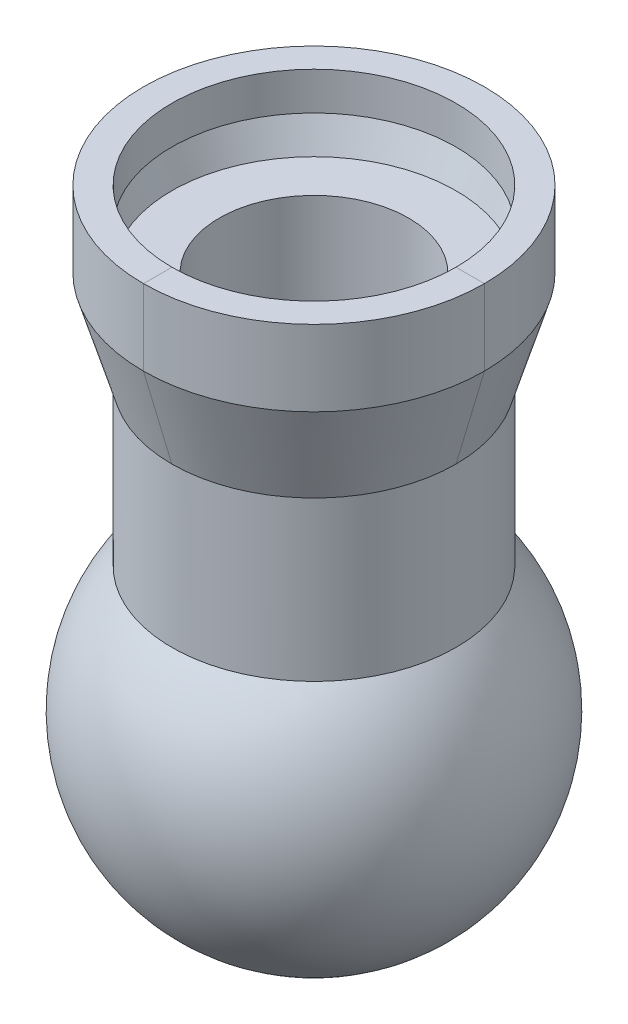
ISO-10303-21;
HEADER;
FILE_DESCRIPTION(('STEP AP214'),'2;1');
FILE_NAME('part.step','',(''),(''),'','','');
FILE_SCHEMA(('AUTOMOTIVE_DESIGN { 1 0 10303 214 1 1 1 1 }'));
ENDSEC;
DATA;
#1=APPLICATION_CONTEXT('core data for automotive mechanical design processes');
#2=APPLICATION_PROTOCOL_DEFINITION('international standard','automotive_design',2000,#1);
#3=PRODUCT_CONTEXT('',#1,'mechanical');
#4=PRODUCT('Part','Part','',(#3));
#5=PRODUCT_RELATED_PRODUCT_CATEGORY('part','',(#4));
#6=PRODUCT_DEFINITION_FORMATION('','',#4);
#7=PRODUCT_DEFINITION_CONTEXT('part definition',#1,'design');
#8=PRODUCT_DEFINITION('design','',#6,#7);
#9=PRODUCT_DEFINITION_SHAPE('','',#8);
#10=(LENGTH_UNIT() NAMED_UNIT(*) SI_UNIT(.MILLI.,.METRE.));
#11=(NAMED_UNIT(*) PLANE_ANGLE_UNIT() SI_UNIT($,.RADIAN.));
#12=(NAMED_UNIT(*) SI_UNIT($,.STERADIAN.) SOLID_ANGLE_UNIT());
#13=UNCERTAINTY_MEASURE_WITH_UNIT(LENGTH_MEASURE(1.E-05),#10,'distance_accuracy_value','');
#14=(GEOMETRIC_REPRESENTATION_CONTEXT(3) GLOBAL_UNCERTAINTY_ASSIGNED_CONTEXT((#13)) GLOBAL_UNIT_ASSIGNED_CONTEXT((#10,
#11,#12)) REPRESENTATION_CONTEXT('',''));
#15=CARTESIAN_POINT('',(0.,0.,0.));
#16=DIRECTION('',(0.,0.,1.));
#17=DIRECTION('',(1.,0.,0.));
#18=AXIS2_PLACEMENT_3D('',#15,#16,#17);
#19=CARTESIAN_POINT('',(0.,0.,0.));
#20=DIRECTION('',(0.,1.,0.));
#21=DIRECTION('',(-1.,0.,0.));
#22=AXIS2_PLACEMENT_3D('',#19,#20,#21);
#23=SPHERICAL_SURFACE('',#22,10.);
#24=CARTESIAN_POINT('',(0.,0.,0.));
#25=DIRECTION('',(0.,0.,1.));
#26=DIRECTION('',(1.,0.,0.));
#27=AXIS2_PLACEMENT_3D('',#24,#25,#26);
#28=CIRCLE('',#27,10.);
#29=CARTESIAN_POINT('',(5.,-8.66025403784439,0.));
#30=VERTEX_POINT('',#29);
#31=CARTESIAN_POINT('',(7.5,6.61437827766148,0.));
#32=VERTEX_POINT('',#31);
#33=EDGE_CURVE('E49',#30,#32,#28,.T.);
#34=ORIENTED_EDGE('',*,*,#33,.F.);
#35=CARTESIAN_POINT('',(0.,-8.66025403784439,0.));
#36=DIRECTION('',(0.,1.,0.));
#37=DIRECTION('',(0.,0.,1.));
#38=AXIS2_PLACEMENT_3D('',#35,#36,#37);
#39=CIRCLE('',#38,5.);
#40=EDGE_CURVE('E43',#30,#30,#39,.T.);
#41=ORIENTED_EDGE('',*,*,#40,.T.);
#42=ORIENTED_EDGE('',*,*,#33,.T.);
#43=CARTESIAN_POINT('',(0.,6.61437827766148,0.));
#44=DIRECTION('',(0.,-1.,0.));
#45=DIRECTION('',(0.,0.,-1.));
#46=AXIS2_PLACEMENT_3D('',#43,#44,#45);
#47=CIRCLE('',#46,7.5);
#48=EDGE_CURVE('E11',#32,#32,#47,.F.);
#49=ORIENTED_EDGE('',*,*,#48,.F.);
#50=EDGE_LOOP('',(#34,#41,#42,#49));
#51=FACE_BOUND('',#50,.T.);
#52=ADVANCED_FACE('F40',(#51),#23,.T.);
#53=CARTESIAN_POINT('',(0.,20.,0.));
#54=DIRECTION('',(0.,-1.,0.));
#55=DIRECTION('',(0.,0.,-1.));
#56=AXIS2_PLACEMENT_3D('',#53,#54,#55);
#57=CYLINDRICAL_SURFACE('',#56,7.5);
#58=CARTESIAN_POINT('',(0.,15.,0.));
#59=DIRECTION('',(0.,-1.,0.));
#60=DIRECTION('',(1.,0.,0.));
#61=AXIS2_PLACEMENT_3D('',#58,#59,#60);
#62=CIRCLE('',#61,7.5);
#63=CARTESIAN_POINT('',(7.5,15.,0.));
#64=VERTEX_POINT('',#63);
#65=CARTESIAN_POINT('',(0.,15.,7.5));
#66=VERTEX_POINT('',#65);
#67=EDGE_CURVE('E126',#64,#66,#62,.T.);
#68=ORIENTED_EDGE('',*,*,#67,.T.);
#69=CARTESIAN_POINT('',(0.,15.,0.));
#70=DIRECTION('',(0.,-1.,0.));
#71=DIRECTION('',(0.,0.,1.));
#72=AXIS2_PLACEMENT_3D('',#69,#70,#71);
#73=CIRCLE('',#72,7.5);
#74=EDGE_CURVE('E117',#66,#64,#73,.T.);
#75=ORIENTED_EDGE('',*,*,#74,.T.);
#76=EDGE_LOOP('',(#68,#75));
#77=FACE_BOUND('',#76,.T.);
#78=ORIENTED_EDGE('',*,*,#48,.T.);
#79=EDGE_LOOP('',(#78));
#80=FACE_BOUND('',#79,.T.);
#81=ADVANCED_FACE('F230',(#77,#80),#57,.T.);
#82=CARTESIAN_POINT('',(0.,22.,0.));
#83=DIRECTION('',(0.,1.,0.));
#84=DIRECTION('',(0.,0.,1.));
#85=AXIS2_PLACEMENT_3D('',#82,#83,#84);
#86=CONICAL_SURFACE('',#85,8.3,0.380506377112365);
#87=DIRECTION('',(-0.371390676354104,-0.928476690885259,0.));
#88=VECTOR('',#87,1.);
#89=CARTESIAN_POINT('',(8.3,22.,0.));
#90=LINE('',#89,#88);
#91=CARTESIAN_POINT('',(8.3,22.,0.));
#92=VERTEX_POINT('',#91);
#93=CARTESIAN_POINT('',(7.5,20.,0.));
#94=VERTEX_POINT('',#93);
#95=EDGE_CURVE('E110',#92,#94,#90,.T.);
#96=ORIENTED_EDGE('',*,*,#95,.F.);
#97=CARTESIAN_POINT('',(0.,22.,0.));
#98=DIRECTION('',(0.,-1.,0.));
#99=DIRECTION('',(0.,0.,1.));
#100=AXIS2_PLACEMENT_3D('',#97,#98,#99);
#101=CIRCLE('',#100,8.3);
#102=CARTESIAN_POINT('',(0.,22.,8.3));
#103=VERTEX_POINT('',#102);
#104=EDGE_CURVE('E131',#103,#92,#101,.T.);
#105=ORIENTED_EDGE('',*,*,#104,.F.);
#106=DIRECTION('',(0.,-0.928476690885259,-0.371390676354104));
#107=VECTOR('',#106,1.);
#108=CARTESIAN_POINT('',(0.,22.,8.3));
#109=LINE('',#108,#107);
#110=CARTESIAN_POINT('',(0.,20.,7.5));
#111=VERTEX_POINT('',#110);
#112=EDGE_CURVE('E113',#103,#111,#109,.T.);
#113=ORIENTED_EDGE('',*,*,#112,.T.);
#114=CARTESIAN_POINT('',(0.,20.,0.));
#115=DIRECTION('',(0.,-1.,0.));
#116=DIRECTION('',(0.,0.,1.));
#117=AXIS2_PLACEMENT_3D('',#114,#115,#116);
#118=CIRCLE('',#117,7.5);
#119=EDGE_CURVE('E107',#111,#94,#118,.T.);
#120=ORIENTED_EDGE('',*,*,#119,.T.);
#121=EDGE_LOOP('',(#96,#105,#113,#120));
#122=FACE_BOUND('',#121,.T.);
#123=ADVANCED_FACE('F109',(#122),#86,.F.);
#124=CARTESIAN_POINT('',(0.,22.,7.5));
#125=DIRECTION('',(0.,-1.,0.));
#126=DIRECTION('',(0.,0.,-1.));
#127=AXIS2_PLACEMENT_3D('',#124,#125,#126);
#128=PLANE('',#127);
#129=DIRECTION('',(1.,0.,0.));
#130=VECTOR('',#129,1.);
#131=CARTESIAN_POINT('',(7.5,22.,0.));
#132=LINE('',#131,#130);
#133=CARTESIAN_POINT('',(7.5,22.,0.));
#134=VERTEX_POINT('',#133);
#135=EDGE_CURVE('E127',#134,#92,#132,.T.);
#136=ORIENTED_EDGE('',*,*,#135,.F.);
#137=CARTESIAN_POINT('',(0.,22.,0.));
#138=DIRECTION('',(0.,-1.,0.));
#139=DIRECTION('',(0.,0.,1.));
#140=AXIS2_PLACEMENT_3D('',#137,#138,#139);
#141=CIRCLE('',#140,7.5);
#142=CARTESIAN_POINT('',(0.,22.,7.5));
#143=VERTEX_POINT('',#142);
#144=EDGE_CURVE('E136',#143,#134,#141,.T.);
#145=ORIENTED_EDGE('',*,*,#144,.F.);
#146=DIRECTION('',(0.,0.,1.));
#147=VECTOR('',#146,1.);
#148=CARTESIAN_POINT('',(0.,22.,7.5));
#149=LINE('',#148,#147);
#150=EDGE_CURVE('E148',#143,#103,#149,.T.);
#151=ORIENTED_EDGE('',*,*,#150,.T.);
#152=ORIENTED_EDGE('',*,*,#104,.T.);
#153=EDGE_LOOP('',(#136,#145,#151,#152));
#154=FACE_BOUND('',#153,.T.);
#155=ADVANCED_FACE('F237',(#154),#128,.T.);
#156=CARTESIAN_POINT('',(0.,20.,0.));
#157=DIRECTION('',(0.,-1.,0.));
#158=DIRECTION('',(0.,0.,-1.));
#159=AXIS2_PLACEMENT_3D('',#156,#157,#158);
#160=CYLINDRICAL_SURFACE('',#159,7.5);
#161=DIRECTION('',(0.,-1.,0.));
#162=VECTOR('',#161,1.);
#163=CARTESIAN_POINT('',(7.5,22.,0.));
#164=LINE('',#163,#162);
#165=CARTESIAN_POINT('',(7.5,24.,0.));
#166=VERTEX_POINT('',#165);
#167=EDGE_CURVE('E159',#166,#134,#164,.T.);
#168=ORIENTED_EDGE('',*,*,#167,.F.);
#169=CARTESIAN_POINT('',(0.,24.,0.));
#170=DIRECTION('',(0.,-1.,0.));
#171=DIRECTION('',(0.,0.,1.));
#172=AXIS2_PLACEMENT_3D('',#169,#170,#171);
#173=CIRCLE('',#172,7.5);
#174=CARTESIAN_POINT('',(0.,24.,7.5));
#175=VERTEX_POINT('',#174);
#176=EDGE_CURVE('E162',#175,#166,#173,.T.);
#177=ORIENTED_EDGE('',*,*,#176,.F.);
#178=DIRECTION('',(0.,-1.,0.));
#179=VECTOR('',#178,1.);
#180=CARTESIAN_POINT('',(0.,22.,7.5));
#181=LINE('',#180,#179);
#182=EDGE_CURVE('E166',#175,#143,#181,.T.);
#183=ORIENTED_EDGE('',*,*,#182,.T.);
#184=ORIENTED_EDGE('',*,*,#144,.T.);
#185=EDGE_LOOP('',(#168,#177,#183,#184));
#186=FACE_BOUND('',#185,.T.);
#187=ADVANCED_FACE('F252',(#186),#160,.F.);
#188=CARTESIAN_POINT('',(0.,24.,7.5));
#189=DIRECTION('',(0.,1.,0.));
#190=DIRECTION('',(0.,0.,1.));
#191=AXIS2_PLACEMENT_3D('',#188,#189,#190);
#192=PLANE('',#191);
#193=DIRECTION('',(-1.,0.,0.));
#194=VECTOR('',#193,1.);
#195=CARTESIAN_POINT('',(7.5,24.,0.));
#196=LINE('',#195,#194);
#197=CARTESIAN_POINT('',(9.,24.,0.));
#198=VERTEX_POINT('',#197);
#199=EDGE_CURVE('E174',#198,#166,#196,.T.);
#200=ORIENTED_EDGE('',*,*,#199,.F.);
#201=CARTESIAN_POINT('',(0.,24.,0.));
#202=DIRECTION('',(0.,-1.,0.));
#203=DIRECTION('',(0.,0.,1.));
#204=AXIS2_PLACEMENT_3D('',#201,#202,#203);
#205=CIRCLE('',#204,9.);
#206=CARTESIAN_POINT('',(0.,24.,9.));
#207=VERTEX_POINT('',#206);
#208=EDGE_CURVE('E177',#207,#198,#205,.T.);
#209=ORIENTED_EDGE('',*,*,#208,.F.);
#210=DIRECTION('',(0.,0.,-1.));
#211=VECTOR('',#210,1.);
#212=CARTESIAN_POINT('',(0.,24.,7.5));
#213=LINE('',#212,#211);
#214=EDGE_CURVE('E181',#207,#175,#213,.T.);
#215=ORIENTED_EDGE('',*,*,#214,.T.);
#216=ORIENTED_EDGE('',*,*,#176,.T.);
#217=EDGE_LOOP('',(#200,#209,#215,#216));
#218=FACE_BOUND('',#217,.T.);
#219=ADVANCED_FACE('F259',(#218),#192,.T.);
#220=CARTESIAN_POINT('',(0.,20.,0.));
#221=DIRECTION('',(0.,-1.,0.));
#222=DIRECTION('',(0.,0.,-1.));
#223=AXIS2_PLACEMENT_3D('',#220,#221,#222);
#224=CYLINDRICAL_SURFACE('',#223,9.);
#225=DIRECTION('',(0.,1.,0.));
#226=VECTOR('',#225,1.);
#227=CARTESIAN_POINT('',(9.,24.,0.));
#228=LINE('',#227,#226);
#229=CARTESIAN_POINT('',(9.,20.,0.));
#230=VERTEX_POINT('',#229);
#231=EDGE_CURVE('E189',#230,#198,#228,.T.);
#232=ORIENTED_EDGE('',*,*,#231,.F.);
#233=CARTESIAN_POINT('',(0.,20.,0.));
#234=DIRECTION('',(0.,-1.,0.));
#235=DIRECTION('',(0.,0.,1.));
#236=AXIS2_PLACEMENT_3D('',#233,#234,#235);
#237=CIRCLE('',#236,9.);
#238=CARTESIAN_POINT('',(0.,20.,9.));
#239=VERTEX_POINT('',#238);
#240=EDGE_CURVE('E192',#239,#230,#237,.T.);
#241=ORIENTED_EDGE('',*,*,#240,.F.);
#242=DIRECTION('',(0.,1.,0.));
#243=VECTOR('',#242,1.);
#244=CARTESIAN_POINT('',(0.,24.,9.));
#245=LINE('',#244,#243);
#246=EDGE_CURVE('E196',#239,#207,#245,.T.);
#247=ORIENTED_EDGE('',*,*,#246,.T.);
#248=ORIENTED_EDGE('',*,*,#208,.T.);
#249=EDGE_LOOP('',(#232,#241,#247,#248));
#250=FACE_BOUND('',#249,.T.);
#251=ADVANCED_FACE('F267',(#250),#224,.T.);
#252=CARTESIAN_POINT('',(0.,15.,0.));
#253=DIRECTION('',(0.,1.,0.));
#254=DIRECTION('',(0.,0.,1.));
#255=AXIS2_PLACEMENT_3D('',#252,#253,#254);
#256=CONICAL_SURFACE('',#255,7.5,0.291456794477867);
#257=DIRECTION('',(0.287347885566345,0.957826285221151,0.));
#258=VECTOR('',#257,1.);
#259=CARTESIAN_POINT('',(7.5,15.,0.));
#260=LINE('',#259,#258);
#261=EDGE_CURVE('E204',#64,#230,#260,.T.);
#262=ORIENTED_EDGE('',*,*,#261,.F.);
#263=ORIENTED_EDGE('',*,*,#74,.F.);
#264=DIRECTION('',(0.,0.957826285221151,0.287347885566345));
#265=VECTOR('',#264,1.);
#266=CARTESIAN_POINT('',(0.,15.,7.5));
#267=LINE('',#266,#265);
#268=EDGE_CURVE('E61',#66,#239,#267,.T.);
#269=ORIENTED_EDGE('',*,*,#268,.T.);
#270=ORIENTED_EDGE('',*,*,#240,.T.);
#271=EDGE_LOOP('',(#262,#263,#269,#270));
#272=FACE_BOUND('',#271,.T.);
#273=ADVANCED_FACE('F249',(#272),#256,.T.);
#274=CARTESIAN_POINT('',(0.,22.,0.));
#275=DIRECTION('',(0.,1.,0.));
#276=DIRECTION('',(0.,0.,1.));
#277=AXIS2_PLACEMENT_3D('',#274,#275,#276);
#278=CONICAL_SURFACE('',#277,8.3,0.380506377112365);
#279=ORIENTED_EDGE('',*,*,#112,.F.);
#280=CARTESIAN_POINT('',(0.,22.,0.));
#281=DIRECTION('',(0.,-1.,0.));
#282=DIRECTION('',(1.,0.,0.));
#283=AXIS2_PLACEMENT_3D('',#280,#281,#282);
#284=CIRCLE('',#283,8.3);
#285=EDGE_CURVE('E124',#92,#103,#284,.T.);
#286=ORIENTED_EDGE('',*,*,#285,.F.);
#287=ORIENTED_EDGE('',*,*,#95,.T.);
#288=CARTESIAN_POINT('',(0.,20.,0.));
#289=DIRECTION('',(0.,1.,0.));
#290=DIRECTION('',(0.,0.,1.));
#291=AXIS2_PLACEMENT_3D('',#288,#289,#290);
#292=CIRCLE('',#291,7.5);
#293=EDGE_CURVE('E122',#111,#94,#292,.T.);
#294=ORIENTED_EDGE('',*,*,#293,.F.);
#295=EDGE_LOOP('',(#279,#286,#287,#294));
#296=FACE_BOUND('',#295,.T.);
#297=ADVANCED_FACE('F121',(#296),#278,.F.);
#298=CARTESIAN_POINT('',(7.5,22.,0.));
#299=DIRECTION('',(0.,-1.,0.));
#300=DIRECTION('',(0.,0.,-1.));
#301=AXIS2_PLACEMENT_3D('',#298,#299,#300);
#302=PLANE('',#301);
#303=ORIENTED_EDGE('',*,*,#285,.T.);
#304=ORIENTED_EDGE('',*,*,#150,.F.);
#305=CARTESIAN_POINT('',(0.,22.,0.));
#306=DIRECTION('',(0.,-1.,0.));
#307=DIRECTION('',(1.,0.,0.));
#308=AXIS2_PLACEMENT_3D('',#305,#306,#307);
#309=CIRCLE('',#308,7.5);
#310=EDGE_CURVE('E154',#134,#143,#309,.T.);
#311=ORIENTED_EDGE('',*,*,#310,.F.);
#312=ORIENTED_EDGE('',*,*,#135,.T.);
#313=EDGE_LOOP('',(#303,#304,#311,#312));
#314=FACE_BOUND('',#313,.T.);
#315=ADVANCED_FACE('F248',(#314),#302,.T.);
#316=CARTESIAN_POINT('',(0.,20.,0.));
#317=DIRECTION('',(0.,-1.,0.));
#318=DIRECTION('',(0.,0.,-1.));
#319=AXIS2_PLACEMENT_3D('',#316,#317,#318);
#320=CYLINDRICAL_SURFACE('',#319,7.5);
#321=ORIENTED_EDGE('',*,*,#310,.T.);
#322=ORIENTED_EDGE('',*,*,#182,.F.);
#323=CARTESIAN_POINT('',(0.,24.,0.));
#324=DIRECTION('',(0.,-1.,0.));
#325=DIRECTION('',(1.,0.,0.));
#326=AXIS2_PLACEMENT_3D('',#323,#324,#325);
#327=CIRCLE('',#326,7.5);
#328=EDGE_CURVE('E170',#166,#175,#327,.T.);
#329=ORIENTED_EDGE('',*,*,#328,.F.);
#330=ORIENTED_EDGE('',*,*,#167,.T.);
#331=EDGE_LOOP('',(#321,#322,#329,#330));
#332=FACE_BOUND('',#331,.T.);
#333=ADVANCED_FACE('F256',(#332),#320,.F.);
#334=CARTESIAN_POINT('',(7.5,24.,0.));
#335=DIRECTION('',(0.,1.,0.));
#336=DIRECTION('',(0.,0.,1.));
#337=AXIS2_PLACEMENT_3D('',#334,#335,#336);
#338=PLANE('',#337);
#339=ORIENTED_EDGE('',*,*,#328,.T.);
#340=ORIENTED_EDGE('',*,*,#214,.F.);
#341=CARTESIAN_POINT('',(0.,24.,0.));
#342=DIRECTION('',(0.,-1.,0.));
#343=DIRECTION('',(1.,0.,0.));
#344=AXIS2_PLACEMENT_3D('',#341,#342,#343);
#345=CIRCLE('',#344,9.);
#346=EDGE_CURVE('E185',#198,#207,#345,.T.);
#347=ORIENTED_EDGE('',*,*,#346,.F.);
#348=ORIENTED_EDGE('',*,*,#199,.T.);
#349=EDGE_LOOP('',(#339,#340,#347,#348));
#350=FACE_BOUND('',#349,.T.);
#351=ADVANCED_FACE('F263',(#350),#338,.T.);
#352=CARTESIAN_POINT('',(0.,20.,0.));
#353=DIRECTION('',(0.,-1.,0.));
#354=DIRECTION('',(0.,0.,-1.));
#355=AXIS2_PLACEMENT_3D('',#352,#353,#354);
#356=CYLINDRICAL_SURFACE('',#355,9.);
#357=ORIENTED_EDGE('',*,*,#346,.T.);
#358=ORIENTED_EDGE('',*,*,#246,.F.);
#359=CARTESIAN_POINT('',(0.,20.,0.));
#360=DIRECTION('',(0.,-1.,0.));
#361=DIRECTION('',(1.,0.,0.));
#362=AXIS2_PLACEMENT_3D('',#359,#360,#361);
#363=CIRCLE('',#362,9.);
#364=EDGE_CURVE('E200',#230,#239,#363,.T.);
#365=ORIENTED_EDGE('',*,*,#364,.F.);
#366=ORIENTED_EDGE('',*,*,#231,.T.);
#367=EDGE_LOOP('',(#357,#358,#365,#366));
#368=FACE_BOUND('',#367,.T.);
#369=ADVANCED_FACE('F271',(#368),#356,.T.);
#370=CARTESIAN_POINT('',(0.,15.,0.));
#371=DIRECTION('',(0.,1.,0.));
#372=DIRECTION('',(0.,0.,1.));
#373=AXIS2_PLACEMENT_3D('',#370,#371,#372);
#374=CONICAL_SURFACE('',#373,7.5,0.291456794477867);
#375=ORIENTED_EDGE('',*,*,#364,.T.);
#376=ORIENTED_EDGE('',*,*,#268,.F.);
#377=ORIENTED_EDGE('',*,*,#67,.F.);
#378=ORIENTED_EDGE('',*,*,#261,.T.);
#379=EDGE_LOOP('',(#375,#376,#377,#378));
#380=FACE_BOUND('',#379,.T.);
#381=ADVANCED_FACE('F243',(#380),#374,.T.);
#382=CARTESIAN_POINT('',(0.,20.,0.));
#383=DIRECTION('',(0.,1.,0.));
#384=DIRECTION('',(0.,0.,1.));
#385=AXIS2_PLACEMENT_3D('',#382,#383,#384);
#386=PLANE('',#385);
#387=CARTESIAN_POINT('',(0.,20.,0.));
#388=DIRECTION('',(0.,1.,0.));
#389=DIRECTION('',(0.,0.,1.));
#390=AXIS2_PLACEMENT_3D('',#387,#388,#389);
#391=CIRCLE('',#390,5.);
#392=CARTESIAN_POINT('',(0.,20.,5.));
#393=VERTEX_POINT('',#392);
#394=EDGE_CURVE('E220',#393,#393,#391,.T.);
#395=ORIENTED_EDGE('',*,*,#394,.F.);
#396=EDGE_LOOP('',(#395));
#397=FACE_BOUND('',#396,.T.);
#398=ORIENTED_EDGE('',*,*,#293,.T.);
#399=ORIENTED_EDGE('',*,*,#119,.F.);
#400=EDGE_LOOP('',(#398,#399));
#401=FACE_BOUND('',#400,.T.);
#402=ADVANCED_FACE('F129',(#397,#401),#386,.T.);
#403=CARTESIAN_POINT('',(0.,-10.,0.));
#404=DIRECTION('',(0.,1.,0.));
#405=DIRECTION('',(0.,0.,1.));
#406=AXIS2_PLACEMENT_3D('',#403,#404,#405);
#407=CYLINDRICAL_SURFACE('',#406,5.);
#408=ORIENTED_EDGE('',*,*,#394,.T.);
#409=EDGE_LOOP('',(#408));
#410=FACE_BOUND('',#409,.T.);
#411=ORIENTED_EDGE('',*,*,#40,.F.);
#412=EDGE_LOOP('',(#411));
#413=FACE_BOUND('',#412,.T.);
#414=ADVANCED_FACE('F242',(#410,#413),#407,.F.);
#415=CLOSED_SHELL('',(#52,#81,#123,#155,#187,#219,#251,#273,#297,#315,#333,#351,#369,#381,#402,#414));
#416=MANIFOLD_SOLID_BREP('B2',#415);
#417=ADVANCED_BREP_SHAPE_REPRESENTATION('',(#18,#416),#14);
#418=SHAPE_DEFINITION_REPRESENTATION(#9,#417);
ENDSEC;
END-ISO-10303-21;
